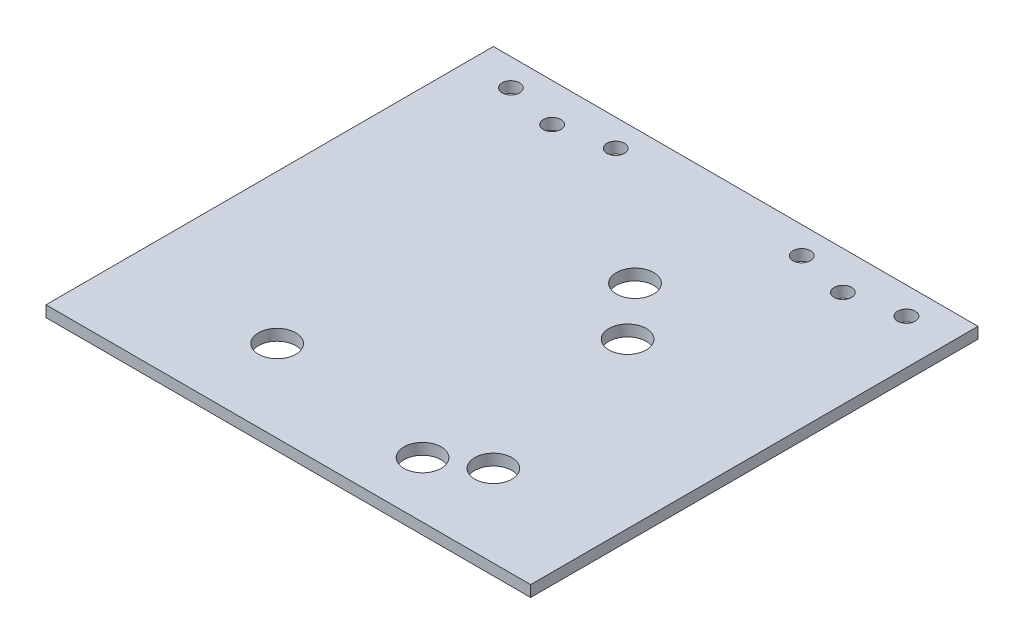
ISO-10303-21;
HEADER;
FILE_DESCRIPTION(('STEP AP214'),'2;1');
FILE_NAME('part.step','',(''),(''),'','','');
FILE_SCHEMA(('AUTOMOTIVE_DESIGN { 1 0 10303 214 1 1 1 1 }'));
ENDSEC;
DATA;
#1=APPLICATION_CONTEXT('core data for automotive mechanical design processes');
#2=APPLICATION_PROTOCOL_DEFINITION('international standard','automotive_design',2000,#1);
#3=PRODUCT_CONTEXT('',#1,'mechanical');
#4=PRODUCT('Part','Part','',(#3));
#5=PRODUCT_RELATED_PRODUCT_CATEGORY('part','',(#4));
#6=PRODUCT_DEFINITION_FORMATION('','',#4);
#7=PRODUCT_DEFINITION_CONTEXT('part definition',#1,'design');
#8=PRODUCT_DEFINITION('design','',#6,#7);
#9=PRODUCT_DEFINITION_SHAPE('','',#8);
#10=(LENGTH_UNIT() NAMED_UNIT(*) SI_UNIT(.MILLI.,.METRE.));
#11=(NAMED_UNIT(*) PLANE_ANGLE_UNIT() SI_UNIT($,.RADIAN.));
#12=(NAMED_UNIT(*) SI_UNIT($,.STERADIAN.) SOLID_ANGLE_UNIT());
#13=UNCERTAINTY_MEASURE_WITH_UNIT(LENGTH_MEASURE(1.E-05),#10,'distance_accuracy_value','');
#14=(GEOMETRIC_REPRESENTATION_CONTEXT(3) GLOBAL_UNCERTAINTY_ASSIGNED_CONTEXT((#13)) GLOBAL_UNIT_ASSIGNED_CONTEXT((#10,
#11,#12)) REPRESENTATION_CONTEXT('',''));
#15=CARTESIAN_POINT('',(0.,0.,0.));
#16=DIRECTION('',(0.,0.,1.));
#17=DIRECTION('',(1.,0.,0.));
#18=AXIS2_PLACEMENT_3D('',#15,#16,#17);
#19=CARTESIAN_POINT('',(0.,3.,0.));
#20=DIRECTION('',(1.,0.,0.));
#21=DIRECTION('',(0.,0.,-1.));
#22=AXIS2_PLACEMENT_3D('',#19,#20,#21);
#23=PLANE('',#22);
#24=DIRECTION('',(0.,-1.,0.));
#25=VECTOR('',#24,1.);
#26=CARTESIAN_POINT('',(0.,3.,30.));
#27=LINE('',#26,#25);
#28=CARTESIAN_POINT('',(0.,3.,30.));
#29=VERTEX_POINT('',#28);
#30=CARTESIAN_POINT('',(0.,0.,30.));
#31=VERTEX_POINT('',#30);
#32=EDGE_CURVE('E122',#29,#31,#27,.T.);
#33=ORIENTED_EDGE('',*,*,#32,.T.);
#34=DIRECTION('',(0.,0.,1.));
#35=VECTOR('',#34,1.);
#36=CARTESIAN_POINT('',(0.,0.,0.));
#37=LINE('',#36,#35);
#38=CARTESIAN_POINT('',(0.,0.,150.));
#39=VERTEX_POINT('',#38);
#40=EDGE_CURVE('E77',#31,#39,#37,.T.);
#41=ORIENTED_EDGE('',*,*,#40,.T.);
#42=DIRECTION('',(0.,-1.,0.));
#43=VECTOR('',#42,1.);
#44=CARTESIAN_POINT('',(0.,3.,150.));
#45=LINE('',#44,#43);
#46=CARTESIAN_POINT('',(0.,3.,150.));
#47=VERTEX_POINT('',#46);
#48=EDGE_CURVE('E11',#47,#39,#45,.T.);
#49=ORIENTED_EDGE('',*,*,#48,.F.);
#50=DIRECTION('',(0.,0.,1.));
#51=VECTOR('',#50,1.);
#52=CARTESIAN_POINT('',(0.,3.,0.));
#53=LINE('',#52,#51);
#54=EDGE_CURVE('E85',#29,#47,#53,.T.);
#55=ORIENTED_EDGE('',*,*,#54,.F.);
#56=EDGE_LOOP('',(#33,#41,#49,#55));
#57=FACE_BOUND('',#56,.T.);
#58=ADVANCED_FACE('F33',(#57),#23,.F.);
#59=CARTESIAN_POINT('',(130.,3.,0.));
#60=DIRECTION('',(-1.,0.,0.));
#61=DIRECTION('',(0.,0.,1.));
#62=AXIS2_PLACEMENT_3D('',#59,#60,#61);
#63=PLANE('',#62);
#64=DIRECTION('',(0.,-1.,0.));
#65=VECTOR('',#64,1.);
#66=CARTESIAN_POINT('',(130.,3.,30.));
#67=LINE('',#66,#65);
#68=CARTESIAN_POINT('',(130.,3.,30.));
#69=VERTEX_POINT('',#68);
#70=CARTESIAN_POINT('',(130.,0.,30.));
#71=VERTEX_POINT('',#70);
#72=EDGE_CURVE('E47',#69,#71,#67,.T.);
#73=ORIENTED_EDGE('',*,*,#72,.F.);
#74=DIRECTION('',(0.,0.,-1.));
#75=VECTOR('',#74,1.);
#76=CARTESIAN_POINT('',(130.,3.,0.));
#77=LINE('',#76,#75);
#78=CARTESIAN_POINT('',(130.,3.,150.));
#79=VERTEX_POINT('',#78);
#80=EDGE_CURVE('E82',#79,#69,#77,.T.);
#81=ORIENTED_EDGE('',*,*,#80,.F.);
#82=DIRECTION('',(0.,-1.,0.));
#83=VECTOR('',#82,1.);
#84=CARTESIAN_POINT('',(130.,3.,150.));
#85=LINE('',#84,#83);
#86=CARTESIAN_POINT('',(130.,0.,150.));
#87=VERTEX_POINT('',#86);
#88=EDGE_CURVE('E40',#79,#87,#85,.T.);
#89=ORIENTED_EDGE('',*,*,#88,.T.);
#90=DIRECTION('',(0.,0.,-1.));
#91=VECTOR('',#90,1.);
#92=CARTESIAN_POINT('',(130.,0.,0.));
#93=LINE('',#92,#91);
#94=EDGE_CURVE('E76',#87,#71,#93,.T.);
#95=ORIENTED_EDGE('',*,*,#94,.T.);
#96=EDGE_LOOP('',(#73,#81,#89,#95));
#97=FACE_BOUND('',#96,.T.);
#98=ADVANCED_FACE('F81',(#97),#63,.F.);
#99=CARTESIAN_POINT('',(0.,3.,0.));
#100=DIRECTION('',(0.,1.,0.));
#101=DIRECTION('',(0.,0.,1.));
#102=AXIS2_PLACEMENT_3D('',#99,#100,#101);
#103=PLANE('',#102);
#104=CARTESIAN_POINT('',(26.,3.,40.25));
#105=DIRECTION('',(0.,1.,0.));
#106=DIRECTION('',(0.,0.,1.));
#107=AXIS2_PLACEMENT_3D('',#104,#105,#106);
#108=CIRCLE('',#107,2.35);
#109=CARTESIAN_POINT('',(26.,3.,37.9));
#110=VERTEX_POINT('',#109);
#111=EDGE_CURVE('E157',#110,#110,#108,.T.);
#112=ORIENTED_EDGE('',*,*,#111,.F.);
#113=EDGE_LOOP('',(#112));
#114=FACE_BOUND('',#113,.T.);
#115=CARTESIAN_POINT('',(40.05,3.,37.25));
#116=DIRECTION('',(0.,1.,0.));
#117=DIRECTION('',(0.,0.,1.));
#118=AXIS2_PLACEMENT_3D('',#115,#116,#117);
#119=CIRCLE('',#118,2.35);
#120=CARTESIAN_POINT('',(40.05,3.,34.9));
#121=VERTEX_POINT('',#120);
#122=EDGE_CURVE('E151',#121,#121,#119,.T.);
#123=ORIENTED_EDGE('',*,*,#122,.F.);
#124=EDGE_LOOP('',(#123));
#125=FACE_BOUND('',#124,.T.);
#126=CARTESIAN_POINT('',(11.95,3.,37.25));
#127=DIRECTION('',(0.,1.,0.));
#128=DIRECTION('',(0.,0.,1.));
#129=AXIS2_PLACEMENT_3D('',#126,#127,#128);
#130=CIRCLE('',#129,2.35);
#131=CARTESIAN_POINT('',(11.95,3.,34.9));
#132=VERTEX_POINT('',#131);
#133=EDGE_CURVE('E145',#132,#132,#130,.T.);
#134=ORIENTED_EDGE('',*,*,#133,.F.);
#135=EDGE_LOOP('',(#134));
#136=FACE_BOUND('',#135,.T.);
#137=CARTESIAN_POINT('',(104.,3.,40.25));
#138=DIRECTION('',(0.,1.,0.));
#139=DIRECTION('',(0.,0.,1.));
#140=AXIS2_PLACEMENT_3D('',#137,#138,#139);
#141=CIRCLE('',#140,2.35);
#142=CARTESIAN_POINT('',(104.,3.,37.9));
#143=VERTEX_POINT('',#142);
#144=EDGE_CURVE('E139',#143,#143,#141,.T.);
#145=ORIENTED_EDGE('',*,*,#144,.F.);
#146=EDGE_LOOP('',(#145));
#147=FACE_BOUND('',#146,.T.);
#148=CARTESIAN_POINT('',(118.05,3.,37.25));
#149=DIRECTION('',(0.,1.,0.));
#150=DIRECTION('',(0.,0.,1.));
#151=AXIS2_PLACEMENT_3D('',#148,#149,#150);
#152=CIRCLE('',#151,2.35);
#153=CARTESIAN_POINT('',(118.05,3.,34.9));
#154=VERTEX_POINT('',#153);
#155=EDGE_CURVE('E133',#154,#154,#152,.T.);
#156=ORIENTED_EDGE('',*,*,#155,.F.);
#157=EDGE_LOOP('',(#156));
#158=FACE_BOUND('',#157,.T.);
#159=CARTESIAN_POINT('',(89.95,3.,37.25));
#160=DIRECTION('',(0.,1.,0.));
#161=DIRECTION('',(0.,0.,1.));
#162=AXIS2_PLACEMENT_3D('',#159,#160,#161);
#163=CIRCLE('',#162,2.35);
#164=CARTESIAN_POINT('',(89.95,3.,34.9));
#165=VERTEX_POINT('',#164);
#166=EDGE_CURVE('E128',#165,#165,#163,.T.);
#167=ORIENTED_EDGE('',*,*,#166,.F.);
#168=EDGE_LOOP('',(#167));
#169=FACE_BOUND('',#168,.T.);
#170=CARTESIAN_POINT('',(74.,3.,66.));
#171=DIRECTION('',(0.,1.,0.));
#172=DIRECTION('',(0.,0.,1.));
#173=AXIS2_PLACEMENT_3D('',#170,#171,#172);
#174=CIRCLE('',#173,5.);
#175=CARTESIAN_POINT('',(74.,3.,71.));
#176=VERTEX_POINT('',#175);
#177=EDGE_CURVE('E95',#176,#176,#174,.T.);
#178=ORIENTED_EDGE('',*,*,#177,.F.);
#179=EDGE_LOOP('',(#178));
#180=FACE_BOUND('',#179,.T.);
#181=CARTESIAN_POINT('',(98.,3.,128.));
#182=DIRECTION('',(0.,1.,0.));
#183=DIRECTION('',(0.,0.,1.));
#184=AXIS2_PLACEMENT_3D('',#181,#182,#183);
#185=CIRCLE('',#184,5.);
#186=CARTESIAN_POINT('',(98.,3.,133.));
#187=VERTEX_POINT('',#186);
#188=EDGE_CURVE('E101',#187,#187,#185,.T.);
#189=ORIENTED_EDGE('',*,*,#188,.F.);
#190=EDGE_LOOP('',(#189));
#191=FACE_BOUND('',#190,.T.);
#192=CARTESIAN_POINT('',(40.,3.,128.));
#193=DIRECTION('',(0.,1.,0.));
#194=DIRECTION('',(0.,0.,1.));
#195=AXIS2_PLACEMENT_3D('',#192,#193,#194);
#196=CIRCLE('',#195,5.);
#197=CARTESIAN_POINT('',(40.,3.,133.));
#198=VERTEX_POINT('',#197);
#199=EDGE_CURVE('E107',#198,#198,#196,.T.);
#200=ORIENTED_EDGE('',*,*,#199,.F.);
#201=EDGE_LOOP('',(#200));
#202=FACE_BOUND('',#201,.T.);
#203=CARTESIAN_POINT('',(86.,3.,80.));
#204=DIRECTION('',(0.,1.,0.));
#205=DIRECTION('',(0.,0.,1.));
#206=AXIS2_PLACEMENT_3D('',#203,#204,#205);
#207=CIRCLE('',#206,5.);
#208=CARTESIAN_POINT('',(86.,3.,85.));
#209=VERTEX_POINT('',#208);
#210=EDGE_CURVE('E113',#209,#209,#207,.T.);
#211=ORIENTED_EDGE('',*,*,#210,.F.);
#212=EDGE_LOOP('',(#211));
#213=FACE_BOUND('',#212,.T.);
#214=CARTESIAN_POINT('',(86.,3.,135.));
#215=DIRECTION('',(0.,1.,0.));
#216=DIRECTION('',(0.,0.,1.));
#217=AXIS2_PLACEMENT_3D('',#214,#215,#216);
#218=CIRCLE('',#217,5.);
#219=CARTESIAN_POINT('',(86.,3.,140.));
#220=VERTEX_POINT('',#219);
#221=EDGE_CURVE('E119',#220,#220,#218,.T.);
#222=ORIENTED_EDGE('',*,*,#221,.F.);
#223=EDGE_LOOP('',(#222));
#224=FACE_BOUND('',#223,.T.);
#225=ORIENTED_EDGE('',*,*,#80,.T.);
#226=DIRECTION('',(1.,0.,0.));
#227=VECTOR('',#226,1.);
#228=CARTESIAN_POINT('',(0.,3.,30.));
#229=LINE('',#228,#227);
#230=EDGE_CURVE('E126',#29,#69,#229,.T.);
#231=ORIENTED_EDGE('',*,*,#230,.F.);
#232=ORIENTED_EDGE('',*,*,#54,.T.);
#233=DIRECTION('',(1.,0.,0.));
#234=VECTOR('',#233,1.);
#235=CARTESIAN_POINT('',(0.,3.,150.));
#236=LINE('',#235,#234);
#237=EDGE_CURVE('E56',#47,#79,#236,.T.);
#238=ORIENTED_EDGE('',*,*,#237,.T.);
#239=EDGE_LOOP('',(#225,#231,#232,#238));
#240=FACE_BOUND('',#239,.T.);
#241=ADVANCED_FACE('F169',(#114,#125,#136,#147,#158,#169,#180,#191,#202,#213,#224,#240),#103,.T.);
#242=CARTESIAN_POINT('',(0.,0.,0.));
#243=DIRECTION('',(0.,1.,0.));
#244=DIRECTION('',(0.,0.,1.));
#245=AXIS2_PLACEMENT_3D('',#242,#243,#244);
#246=PLANE('',#245);
#247=CARTESIAN_POINT('',(26.,0.,40.25));
#248=DIRECTION('',(0.,1.,0.));
#249=DIRECTION('',(0.,0.,1.));
#250=AXIS2_PLACEMENT_3D('',#247,#248,#249);
#251=CIRCLE('',#250,2.35);
#252=CARTESIAN_POINT('',(26.,0.,37.9));
#253=VERTEX_POINT('',#252);
#254=EDGE_CURVE('E160',#253,#253,#251,.T.);
#255=ORIENTED_EDGE('',*,*,#254,.T.);
#256=EDGE_LOOP('',(#255));
#257=FACE_BOUND('',#256,.T.);
#258=CARTESIAN_POINT('',(40.05,0.,37.25));
#259=DIRECTION('',(0.,1.,0.));
#260=DIRECTION('',(0.,0.,1.));
#261=AXIS2_PLACEMENT_3D('',#258,#259,#260);
#262=CIRCLE('',#261,2.35);
#263=CARTESIAN_POINT('',(40.05,0.,34.9));
#264=VERTEX_POINT('',#263);
#265=EDGE_CURVE('E154',#264,#264,#262,.T.);
#266=ORIENTED_EDGE('',*,*,#265,.T.);
#267=EDGE_LOOP('',(#266));
#268=FACE_BOUND('',#267,.T.);
#269=CARTESIAN_POINT('',(11.95,0.,37.25));
#270=DIRECTION('',(0.,1.,0.));
#271=DIRECTION('',(0.,0.,1.));
#272=AXIS2_PLACEMENT_3D('',#269,#270,#271);
#273=CIRCLE('',#272,2.35);
#274=CARTESIAN_POINT('',(11.95,0.,34.9));
#275=VERTEX_POINT('',#274);
#276=EDGE_CURVE('E148',#275,#275,#273,.T.);
#277=ORIENTED_EDGE('',*,*,#276,.T.);
#278=EDGE_LOOP('',(#277));
#279=FACE_BOUND('',#278,.T.);
#280=CARTESIAN_POINT('',(104.,0.,40.25));
#281=DIRECTION('',(0.,1.,0.));
#282=DIRECTION('',(0.,0.,1.));
#283=AXIS2_PLACEMENT_3D('',#280,#281,#282);
#284=CIRCLE('',#283,2.35);
#285=CARTESIAN_POINT('',(104.,0.,37.9));
#286=VERTEX_POINT('',#285);
#287=EDGE_CURVE('E142',#286,#286,#284,.T.);
#288=ORIENTED_EDGE('',*,*,#287,.T.);
#289=EDGE_LOOP('',(#288));
#290=FACE_BOUND('',#289,.T.);
#291=CARTESIAN_POINT('',(118.05,0.,37.25));
#292=DIRECTION('',(0.,1.,0.));
#293=DIRECTION('',(0.,0.,1.));
#294=AXIS2_PLACEMENT_3D('',#291,#292,#293);
#295=CIRCLE('',#294,2.35);
#296=CARTESIAN_POINT('',(118.05,0.,34.9));
#297=VERTEX_POINT('',#296);
#298=EDGE_CURVE('E136',#297,#297,#295,.T.);
#299=ORIENTED_EDGE('',*,*,#298,.T.);
#300=EDGE_LOOP('',(#299));
#301=FACE_BOUND('',#300,.T.);
#302=CARTESIAN_POINT('',(89.95,0.,37.25));
#303=DIRECTION('',(0.,1.,0.));
#304=DIRECTION('',(0.,0.,1.));
#305=AXIS2_PLACEMENT_3D('',#302,#303,#304);
#306=CIRCLE('',#305,2.35);
#307=CARTESIAN_POINT('',(89.95,0.,34.9));
#308=VERTEX_POINT('',#307);
#309=EDGE_CURVE('E130',#308,#308,#306,.T.);
#310=ORIENTED_EDGE('',*,*,#309,.T.);
#311=EDGE_LOOP('',(#310));
#312=FACE_BOUND('',#311,.T.);
#313=CARTESIAN_POINT('',(74.,0.,66.));
#314=DIRECTION('',(0.,1.,0.));
#315=DIRECTION('',(0.,0.,1.));
#316=AXIS2_PLACEMENT_3D('',#313,#314,#315);
#317=CIRCLE('',#316,5.);
#318=CARTESIAN_POINT('',(74.,0.,71.));
#319=VERTEX_POINT('',#318);
#320=EDGE_CURVE('E90',#319,#319,#317,.T.);
#321=ORIENTED_EDGE('',*,*,#320,.T.);
#322=EDGE_LOOP('',(#321));
#323=FACE_BOUND('',#322,.T.);
#324=CARTESIAN_POINT('',(98.,0.,128.));
#325=DIRECTION('',(0.,1.,0.));
#326=DIRECTION('',(0.,0.,1.));
#327=AXIS2_PLACEMENT_3D('',#324,#325,#326);
#328=CIRCLE('',#327,5.);
#329=CARTESIAN_POINT('',(98.,0.,133.));
#330=VERTEX_POINT('',#329);
#331=EDGE_CURVE('E98',#330,#330,#328,.T.);
#332=ORIENTED_EDGE('',*,*,#331,.T.);
#333=EDGE_LOOP('',(#332));
#334=FACE_BOUND('',#333,.T.);
#335=CARTESIAN_POINT('',(40.,0.,128.));
#336=DIRECTION('',(0.,1.,0.));
#337=DIRECTION('',(0.,0.,1.));
#338=AXIS2_PLACEMENT_3D('',#335,#336,#337);
#339=CIRCLE('',#338,5.);
#340=CARTESIAN_POINT('',(40.,0.,133.));
#341=VERTEX_POINT('',#340);
#342=EDGE_CURVE('E104',#341,#341,#339,.T.);
#343=ORIENTED_EDGE('',*,*,#342,.T.);
#344=EDGE_LOOP('',(#343));
#345=FACE_BOUND('',#344,.T.);
#346=CARTESIAN_POINT('',(86.,0.,80.));
#347=DIRECTION('',(0.,1.,0.));
#348=DIRECTION('',(0.,0.,1.));
#349=AXIS2_PLACEMENT_3D('',#346,#347,#348);
#350=CIRCLE('',#349,5.);
#351=CARTESIAN_POINT('',(86.,0.,85.));
#352=VERTEX_POINT('',#351);
#353=EDGE_CURVE('E110',#352,#352,#350,.T.);
#354=ORIENTED_EDGE('',*,*,#353,.T.);
#355=EDGE_LOOP('',(#354));
#356=FACE_BOUND('',#355,.T.);
#357=CARTESIAN_POINT('',(86.,0.,135.));
#358=DIRECTION('',(0.,1.,0.));
#359=DIRECTION('',(0.,0.,1.));
#360=AXIS2_PLACEMENT_3D('',#357,#358,#359);
#361=CIRCLE('',#360,5.);
#362=CARTESIAN_POINT('',(86.,0.,140.));
#363=VERTEX_POINT('',#362);
#364=EDGE_CURVE('E116',#363,#363,#361,.T.);
#365=ORIENTED_EDGE('',*,*,#364,.T.);
#366=EDGE_LOOP('',(#365));
#367=FACE_BOUND('',#366,.T.);
#368=DIRECTION('',(1.,0.,0.));
#369=VECTOR('',#368,1.);
#370=CARTESIAN_POINT('',(0.,0.,30.));
#371=LINE('',#370,#369);
#372=EDGE_CURVE('E84',#31,#71,#371,.T.);
#373=ORIENTED_EDGE('',*,*,#372,.T.);
#374=ORIENTED_EDGE('',*,*,#94,.F.);
#375=DIRECTION('',(1.,0.,0.));
#376=VECTOR('',#375,1.);
#377=CARTESIAN_POINT('',(0.,0.,150.));
#378=LINE('',#377,#376);
#379=EDGE_CURVE('E68',#39,#87,#378,.T.);
#380=ORIENTED_EDGE('',*,*,#379,.F.);
#381=ORIENTED_EDGE('',*,*,#40,.F.);
#382=EDGE_LOOP('',(#373,#374,#380,#381));
#383=FACE_BOUND('',#382,.T.);
#384=ADVANCED_FACE('F83',(#257,#268,#279,#290,#301,#312,#323,#334,#345,#356,#367,#383),#246,.F.);
#385=CARTESIAN_POINT('',(0.,3.,150.));
#386=DIRECTION('',(0.,0.,-1.));
#387=DIRECTION('',(-1.,0.,0.));
#388=AXIS2_PLACEMENT_3D('',#385,#386,#387);
#389=PLANE('',#388);
#390=ORIENTED_EDGE('',*,*,#379,.T.);
#391=ORIENTED_EDGE('',*,*,#88,.F.);
#392=ORIENTED_EDGE('',*,*,#237,.F.);
#393=ORIENTED_EDGE('',*,*,#48,.T.);
#394=EDGE_LOOP('',(#390,#391,#392,#393));
#395=FACE_BOUND('',#394,.T.);
#396=ADVANCED_FACE('F70',(#395),#389,.F.);
#397=CARTESIAN_POINT('',(74.,3.,66.));
#398=DIRECTION('',(0.,1.,0.));
#399=DIRECTION('',(0.,0.,1.));
#400=AXIS2_PLACEMENT_3D('',#397,#398,#399);
#401=CYLINDRICAL_SURFACE('',#400,5.);
#402=ORIENTED_EDGE('',*,*,#320,.F.);
#403=EDGE_LOOP('',(#402));
#404=FACE_BOUND('',#403,.T.);
#405=ORIENTED_EDGE('',*,*,#177,.T.);
#406=EDGE_LOOP('',(#405));
#407=FACE_BOUND('',#406,.T.);
#408=ADVANCED_FACE('F210',(#404,#407),#401,.F.);
#409=CARTESIAN_POINT('',(98.,3.,128.));
#410=DIRECTION('',(0.,1.,0.));
#411=DIRECTION('',(0.,0.,1.));
#412=AXIS2_PLACEMENT_3D('',#409,#410,#411);
#413=CYLINDRICAL_SURFACE('',#412,5.);
#414=ORIENTED_EDGE('',*,*,#331,.F.);
#415=EDGE_LOOP('',(#414));
#416=FACE_BOUND('',#415,.T.);
#417=ORIENTED_EDGE('',*,*,#188,.T.);
#418=EDGE_LOOP('',(#417));
#419=FACE_BOUND('',#418,.T.);
#420=ADVANCED_FACE('F215',(#416,#419),#413,.F.);
#421=CARTESIAN_POINT('',(40.,3.,128.));
#422=DIRECTION('',(0.,1.,0.));
#423=DIRECTION('',(0.,0.,1.));
#424=AXIS2_PLACEMENT_3D('',#421,#422,#423);
#425=CYLINDRICAL_SURFACE('',#424,5.);
#426=ORIENTED_EDGE('',*,*,#342,.F.);
#427=EDGE_LOOP('',(#426));
#428=FACE_BOUND('',#427,.T.);
#429=ORIENTED_EDGE('',*,*,#199,.T.);
#430=EDGE_LOOP('',(#429));
#431=FACE_BOUND('',#430,.T.);
#432=ADVANCED_FACE('F254',(#428,#431),#425,.F.);
#433=CARTESIAN_POINT('',(86.,3.,80.));
#434=DIRECTION('',(0.,1.,0.));
#435=DIRECTION('',(0.,0.,1.));
#436=AXIS2_PLACEMENT_3D('',#433,#434,#435);
#437=CYLINDRICAL_SURFACE('',#436,5.);
#438=ORIENTED_EDGE('',*,*,#353,.F.);
#439=EDGE_LOOP('',(#438));
#440=FACE_BOUND('',#439,.T.);
#441=ORIENTED_EDGE('',*,*,#210,.T.);
#442=EDGE_LOOP('',(#441));
#443=FACE_BOUND('',#442,.T.);
#444=ADVANCED_FACE('F246',(#440,#443),#437,.F.);
#445=CARTESIAN_POINT('',(86.,3.,135.));
#446=DIRECTION('',(0.,1.,0.));
#447=DIRECTION('',(0.,0.,1.));
#448=AXIS2_PLACEMENT_3D('',#445,#446,#447);
#449=CYLINDRICAL_SURFACE('',#448,5.);
#450=ORIENTED_EDGE('',*,*,#364,.F.);
#451=EDGE_LOOP('',(#450));
#452=FACE_BOUND('',#451,.T.);
#453=ORIENTED_EDGE('',*,*,#221,.T.);
#454=EDGE_LOOP('',(#453));
#455=FACE_BOUND('',#454,.T.);
#456=ADVANCED_FACE('F243',(#452,#455),#449,.F.);
#457=CARTESIAN_POINT('',(0.,3.,30.));
#458=DIRECTION('',(0.,0.,-1.));
#459=DIRECTION('',(-1.,0.,0.));
#460=AXIS2_PLACEMENT_3D('',#457,#458,#459);
#461=PLANE('',#460);
#462=ORIENTED_EDGE('',*,*,#372,.F.);
#463=ORIENTED_EDGE('',*,*,#32,.F.);
#464=ORIENTED_EDGE('',*,*,#230,.T.);
#465=ORIENTED_EDGE('',*,*,#72,.T.);
#466=EDGE_LOOP('',(#462,#463,#464,#465));
#467=FACE_BOUND('',#466,.T.);
#468=ADVANCED_FACE('F199',(#467),#461,.T.);
#469=CARTESIAN_POINT('',(89.95,3.,37.25));
#470=DIRECTION('',(0.,-1.,0.));
#471=DIRECTION('',(0.,0.,-1.));
#472=AXIS2_PLACEMENT_3D('',#469,#470,#471);
#473=CYLINDRICAL_SURFACE('',#472,2.35);
#474=CARTESIAN_POINT('',(89.95,3.,34.9));
#475=CARTESIAN_POINT('',(89.95,2.96875,34.9));
#476=CARTESIAN_POINT('',(89.95,2.9375,34.9));
#477=CARTESIAN_POINT('',(89.95,2.875,34.9));
#478=CARTESIAN_POINT('',(89.95,2.84375,34.9));
#479=CARTESIAN_POINT('',(89.95,2.78125,34.9));
#480=CARTESIAN_POINT('',(89.95,2.75,34.9));
#481=CARTESIAN_POINT('',(89.95,2.6875,34.9));
#482=CARTESIAN_POINT('',(89.95,2.65625,34.9));
#483=CARTESIAN_POINT('',(89.95,2.59375,34.9));
#484=CARTESIAN_POINT('',(89.95,2.5625,34.9));
#485=CARTESIAN_POINT('',(89.95,2.5,34.9));
#486=CARTESIAN_POINT('',(89.95,2.46875,34.9));
#487=CARTESIAN_POINT('',(89.95,2.40625,34.9));
#488=CARTESIAN_POINT('',(89.95,2.375,34.9));
#489=CARTESIAN_POINT('',(89.95,2.3125,34.9));
#490=CARTESIAN_POINT('',(89.95,2.28125,34.9));
#491=CARTESIAN_POINT('',(89.95,2.21875,34.9));
#492=CARTESIAN_POINT('',(89.95,2.1875,34.9));
#493=CARTESIAN_POINT('',(89.95,2.125,34.9));
#494=CARTESIAN_POINT('',(89.95,2.09375,34.9));
#495=CARTESIAN_POINT('',(89.95,2.03125,34.9));
#496=CARTESIAN_POINT('',(89.95,2.,34.9));
#497=CARTESIAN_POINT('',(89.95,1.9375,34.9));
#498=CARTESIAN_POINT('',(89.95,1.90625,34.9));
#499=CARTESIAN_POINT('',(89.95,1.84375,34.9));
#500=CARTESIAN_POINT('',(89.95,1.8125,34.9));
#501=CARTESIAN_POINT('',(89.95,1.75,34.9));
#502=CARTESIAN_POINT('',(89.95,1.71875,34.9));
#503=CARTESIAN_POINT('',(89.95,1.65625,34.9));
#504=CARTESIAN_POINT('',(89.95,1.625,34.9));
#505=CARTESIAN_POINT('',(89.95,1.5625,34.9));
#506=CARTESIAN_POINT('',(89.95,1.53125,34.9));
#507=CARTESIAN_POINT('',(89.95,1.46875,34.9));
#508=CARTESIAN_POINT('',(89.95,1.4375,34.9));
#509=CARTESIAN_POINT('',(89.95,1.375,34.9));
#510=CARTESIAN_POINT('',(89.95,1.34375,34.9));
#511=CARTESIAN_POINT('',(89.95,1.28125,34.9));
#512=CARTESIAN_POINT('',(89.95,1.25,34.9));
#513=CARTESIAN_POINT('',(89.95,1.1875,34.9));
#514=CARTESIAN_POINT('',(89.95,1.15625,34.9));
#515=CARTESIAN_POINT('',(89.95,1.09375,34.9));
#516=CARTESIAN_POINT('',(89.95,1.0625,34.9));
#517=CARTESIAN_POINT('',(89.95,1.,34.9));
#518=CARTESIAN_POINT('',(89.95,0.96875,34.9));
#519=CARTESIAN_POINT('',(89.95,0.90625,34.9));
#520=CARTESIAN_POINT('',(89.95,0.875,34.9));
#521=CARTESIAN_POINT('',(89.95,0.8125,34.9));
#522=CARTESIAN_POINT('',(89.95,0.78125,34.9));
#523=CARTESIAN_POINT('',(89.95,0.71875,34.9));
#524=CARTESIAN_POINT('',(89.95,0.6875,34.9));
#525=CARTESIAN_POINT('',(89.95,0.625,34.9));
#526=CARTESIAN_POINT('',(89.95,0.59375,34.9));
#527=CARTESIAN_POINT('',(89.95,0.53125,34.9));
#528=CARTESIAN_POINT('',(89.95,0.5,34.9));
#529=CARTESIAN_POINT('',(89.95,0.4375,34.9));
#530=CARTESIAN_POINT('',(89.95,0.40625,34.9));
#531=CARTESIAN_POINT('',(89.95,0.34375,34.9));
#532=CARTESIAN_POINT('',(89.95,0.3125,34.9));
#533=CARTESIAN_POINT('',(89.95,0.25,34.9));
#534=CARTESIAN_POINT('',(89.95,0.21875,34.9));
#535=CARTESIAN_POINT('',(89.95,0.15625,34.9));
#536=CARTESIAN_POINT('',(89.95,0.125,34.9));
#537=CARTESIAN_POINT('',(89.95,0.0625000000000001,34.9));
#538=CARTESIAN_POINT('',(89.95,0.03125,34.9));
#539=CARTESIAN_POINT('',(89.95,0.,34.9));
#540=B_SPLINE_CURVE_WITH_KNOTS('',3,(#474,#475,#476,#477,#478,#479,#480,#481,#482,#483,#484,
#485,#486,#487,#488,#489,#490,#491,#492,#493,#494,#495,#496,#497,#498,#499,#500,#501,#502,#503,
#504,#505,#506,#507,#508,#509,#510,#511,#512,#513,#514,#515,#516,#517,#518,#519,#520,#521,#522,
#523,#524,#525,#526,#527,#528,#529,#530,#531,#532,#533,#534,#535,#536,#537,#538,#539),
.UNSPECIFIED.,.F.,.F.,(4,2,2,2,2,2,2,2,2,2,2,2,2,2,2,2,2,2,2,2,2,2,2,2,2,2,2,2,2,2,2,2,4),(0.,
0.0937499999999997,0.1875,0.28125,0.375,0.46875,0.5625,0.65625,0.75,0.84375,0.9375,1.03125,
1.125,1.21875,1.3125,1.40625,1.5,1.59375,1.6875,1.78125,1.875,1.96875,2.0625,2.15625,2.25,
2.34375,2.4375,2.53125,2.625,2.71875,2.8125,2.90625,3.),.UNSPECIFIED.);
#541=EDGE_CURVE('BSEAM252',#165,#308,#540,.T.);
#542=ORIENTED_EDGE('',*,*,#166,.T.);
#543=ORIENTED_EDGE('',*,*,#309,.F.);
#544=ORIENTED_EDGE('',*,*,#541,.T.);
#545=ORIENTED_EDGE('',*,*,#541,.F.);
#546=EDGE_LOOP('',(#542,#544,#543,#545));
#547=FACE_BOUND('',#546,.T.);
#548=ADVANCED_FACE('F252',(#547),#473,.F.);
#549=CARTESIAN_POINT('',(118.05,3.,37.25));
#550=DIRECTION('',(0.,-1.,0.));
#551=DIRECTION('',(0.,0.,-1.));
#552=AXIS2_PLACEMENT_3D('',#549,#550,#551);
#553=CYLINDRICAL_SURFACE('',#552,2.35);
#554=CARTESIAN_POINT('',(118.05,3.,34.9));
#555=CARTESIAN_POINT('',(118.05,2.96875,34.9));
#556=CARTESIAN_POINT('',(118.05,2.9375,34.9));
#557=CARTESIAN_POINT('',(118.05,2.875,34.9));
#558=CARTESIAN_POINT('',(118.05,2.84375,34.9));
#559=CARTESIAN_POINT('',(118.05,2.78125,34.9));
#560=CARTESIAN_POINT('',(118.05,2.75,34.9));
#561=CARTESIAN_POINT('',(118.05,2.6875,34.9));
#562=CARTESIAN_POINT('',(118.05,2.65625,34.9));
#563=CARTESIAN_POINT('',(118.05,2.59375,34.9));
#564=CARTESIAN_POINT('',(118.05,2.5625,34.9));
#565=CARTESIAN_POINT('',(118.05,2.5,34.9));
#566=CARTESIAN_POINT('',(118.05,2.46875,34.9));
#567=CARTESIAN_POINT('',(118.05,2.40625,34.9));
#568=CARTESIAN_POINT('',(118.05,2.375,34.9));
#569=CARTESIAN_POINT('',(118.05,2.3125,34.9));
#570=CARTESIAN_POINT('',(118.05,2.28125,34.9));
#571=CARTESIAN_POINT('',(118.05,2.21875,34.9));
#572=CARTESIAN_POINT('',(118.05,2.1875,34.9));
#573=CARTESIAN_POINT('',(118.05,2.125,34.9));
#574=CARTESIAN_POINT('',(118.05,2.09375,34.9));
#575=CARTESIAN_POINT('',(118.05,2.03125,34.9));
#576=CARTESIAN_POINT('',(118.05,2.,34.9));
#577=CARTESIAN_POINT('',(118.05,1.9375,34.9));
#578=CARTESIAN_POINT('',(118.05,1.90625,34.9));
#579=CARTESIAN_POINT('',(118.05,1.84375,34.9));
#580=CARTESIAN_POINT('',(118.05,1.8125,34.9));
#581=CARTESIAN_POINT('',(118.05,1.75,34.9));
#582=CARTESIAN_POINT('',(118.05,1.71875,34.9));
#583=CARTESIAN_POINT('',(118.05,1.65625,34.9));
#584=CARTESIAN_POINT('',(118.05,1.625,34.9));
#585=CARTESIAN_POINT('',(118.05,1.5625,34.9));
#586=CARTESIAN_POINT('',(118.05,1.53125,34.9));
#587=CARTESIAN_POINT('',(118.05,1.46875,34.9));
#588=CARTESIAN_POINT('',(118.05,1.4375,34.9));
#589=CARTESIAN_POINT('',(118.05,1.375,34.9));
#590=CARTESIAN_POINT('',(118.05,1.34375,34.9));
#591=CARTESIAN_POINT('',(118.05,1.28125,34.9));
#592=CARTESIAN_POINT('',(118.05,1.25,34.9));
#593=CARTESIAN_POINT('',(118.05,1.1875,34.9));
#594=CARTESIAN_POINT('',(118.05,1.15625,34.9));
#595=CARTESIAN_POINT('',(118.05,1.09375,34.9));
#596=CARTESIAN_POINT('',(118.05,1.0625,34.9));
#597=CARTESIAN_POINT('',(118.05,1.,34.9));
#598=CARTESIAN_POINT('',(118.05,0.96875,34.9));
#599=CARTESIAN_POINT('',(118.05,0.90625,34.9));
#600=CARTESIAN_POINT('',(118.05,0.875,34.9));
#601=CARTESIAN_POINT('',(118.05,0.8125,34.9));
#602=CARTESIAN_POINT('',(118.05,0.78125,34.9));
#603=CARTESIAN_POINT('',(118.05,0.71875,34.9));
#604=CARTESIAN_POINT('',(118.05,0.6875,34.9));
#605=CARTESIAN_POINT('',(118.05,0.625,34.9));
#606=CARTESIAN_POINT('',(118.05,0.59375,34.9));
#607=CARTESIAN_POINT('',(118.05,0.53125,34.9));
#608=CARTESIAN_POINT('',(118.05,0.5,34.9));
#609=CARTESIAN_POINT('',(118.05,0.4375,34.9));
#610=CARTESIAN_POINT('',(118.05,0.40625,34.9));
#611=CARTESIAN_POINT('',(118.05,0.34375,34.9));
#612=CARTESIAN_POINT('',(118.05,0.3125,34.9));
#613=CARTESIAN_POINT('',(118.05,0.25,34.9));
#614=CARTESIAN_POINT('',(118.05,0.21875,34.9));
#615=CARTESIAN_POINT('',(118.05,0.15625,34.9));
#616=CARTESIAN_POINT('',(118.05,0.125,34.9));
#617=CARTESIAN_POINT('',(118.05,0.0625000000000001,34.9));
#618=CARTESIAN_POINT('',(118.05,0.03125,34.9));
#619=CARTESIAN_POINT('',(118.05,0.,34.9));
#620=B_SPLINE_CURVE_WITH_KNOTS('',3,(#554,#555,#556,#557,#558,#559,#560,#561,#562,#563,#564,
#565,#566,#567,#568,#569,#570,#571,#572,#573,#574,#575,#576,#577,#578,#579,#580,#581,#582,#583,
#584,#585,#586,#587,#588,#589,#590,#591,#592,#593,#594,#595,#596,#597,#598,#599,#600,#601,#602,
#603,#604,#605,#606,#607,#608,#609,#610,#611,#612,#613,#614,#615,#616,#617,#618,#619),
.UNSPECIFIED.,.F.,.F.,(4,2,2,2,2,2,2,2,2,2,2,2,2,2,2,2,2,2,2,2,2,2,2,2,2,2,2,2,2,2,2,2,4),(0.,
0.0937499999999997,0.1875,0.28125,0.375,0.46875,0.5625,0.65625,0.75,0.84375,0.9375,1.03125,
1.125,1.21875,1.3125,1.40625,1.5,1.59375,1.6875,1.78125,1.875,1.96875,2.0625,2.15625,2.25,
2.34375,2.4375,2.53125,2.625,2.71875,2.8125,2.90625,3.),.UNSPECIFIED.);
#621=EDGE_CURVE('BSEAM314',#154,#297,#620,.T.);
#622=ORIENTED_EDGE('',*,*,#155,.T.);
#623=ORIENTED_EDGE('',*,*,#298,.F.);
#624=ORIENTED_EDGE('',*,*,#621,.T.);
#625=ORIENTED_EDGE('',*,*,#621,.F.);
#626=EDGE_LOOP('',(#622,#624,#623,#625));
#627=FACE_BOUND('',#626,.T.);
#628=ADVANCED_FACE('F314',(#627),#553,.F.);
#629=CARTESIAN_POINT('',(104.,3.,40.25));
#630=DIRECTION('',(0.,-1.,0.));
#631=DIRECTION('',(0.,0.,-1.));
#632=AXIS2_PLACEMENT_3D('',#629,#630,#631);
#633=CYLINDRICAL_SURFACE('',#632,2.35);
#634=CARTESIAN_POINT('',(104.,3.,37.9));
#635=CARTESIAN_POINT('',(104.,2.96875,37.9));
#636=CARTESIAN_POINT('',(104.,2.9375,37.9));
#637=CARTESIAN_POINT('',(104.,2.875,37.9));
#638=CARTESIAN_POINT('',(104.,2.84375,37.9));
#639=CARTESIAN_POINT('',(104.,2.78125,37.9));
#640=CARTESIAN_POINT('',(104.,2.75,37.9));
#641=CARTESIAN_POINT('',(104.,2.6875,37.9));
#642=CARTESIAN_POINT('',(104.,2.65625,37.9));
#643=CARTESIAN_POINT('',(104.,2.59375,37.9));
#644=CARTESIAN_POINT('',(104.,2.5625,37.9));
#645=CARTESIAN_POINT('',(104.,2.5,37.9));
#646=CARTESIAN_POINT('',(104.,2.46875,37.9));
#647=CARTESIAN_POINT('',(104.,2.40625,37.9));
#648=CARTESIAN_POINT('',(104.,2.375,37.9));
#649=CARTESIAN_POINT('',(104.,2.3125,37.9));
#650=CARTESIAN_POINT('',(104.,2.28125,37.9));
#651=CARTESIAN_POINT('',(104.,2.21875,37.9));
#652=CARTESIAN_POINT('',(104.,2.1875,37.9));
#653=CARTESIAN_POINT('',(104.,2.125,37.9));
#654=CARTESIAN_POINT('',(104.,2.09375,37.9));
#655=CARTESIAN_POINT('',(104.,2.03125,37.9));
#656=CARTESIAN_POINT('',(104.,2.,37.9));
#657=CARTESIAN_POINT('',(104.,1.9375,37.9));
#658=CARTESIAN_POINT('',(104.,1.90625,37.9));
#659=CARTESIAN_POINT('',(104.,1.84375,37.9));
#660=CARTESIAN_POINT('',(104.,1.8125,37.9));
#661=CARTESIAN_POINT('',(104.,1.75,37.9));
#662=CARTESIAN_POINT('',(104.,1.71875,37.9));
#663=CARTESIAN_POINT('',(104.,1.65625,37.9));
#664=CARTESIAN_POINT('',(104.,1.625,37.9));
#665=CARTESIAN_POINT('',(104.,1.5625,37.9));
#666=CARTESIAN_POINT('',(104.,1.53125,37.9));
#667=CARTESIAN_POINT('',(104.,1.46875,37.9));
#668=CARTESIAN_POINT('',(104.,1.4375,37.9));
#669=CARTESIAN_POINT('',(104.,1.375,37.9));
#670=CARTESIAN_POINT('',(104.,1.34375,37.9));
#671=CARTESIAN_POINT('',(104.,1.28125,37.9));
#672=CARTESIAN_POINT('',(104.,1.25,37.9));
#673=CARTESIAN_POINT('',(104.,1.1875,37.9));
#674=CARTESIAN_POINT('',(104.,1.15625,37.9));
#675=CARTESIAN_POINT('',(104.,1.09375,37.9));
#676=CARTESIAN_POINT('',(104.,1.0625,37.9));
#677=CARTESIAN_POINT('',(104.,1.,37.9));
#678=CARTESIAN_POINT('',(104.,0.96875,37.9));
#679=CARTESIAN_POINT('',(104.,0.90625,37.9));
#680=CARTESIAN_POINT('',(104.,0.875,37.9));
#681=CARTESIAN_POINT('',(104.,0.8125,37.9));
#682=CARTESIAN_POINT('',(104.,0.78125,37.9));
#683=CARTESIAN_POINT('',(104.,0.71875,37.9));
#684=CARTESIAN_POINT('',(104.,0.6875,37.9));
#685=CARTESIAN_POINT('',(104.,0.625,37.9));
#686=CARTESIAN_POINT('',(104.,0.59375,37.9));
#687=CARTESIAN_POINT('',(104.,0.53125,37.9));
#688=CARTESIAN_POINT('',(104.,0.5,37.9));
#689=CARTESIAN_POINT('',(104.,0.4375,37.9));
#690=CARTESIAN_POINT('',(104.,0.40625,37.9));
#691=CARTESIAN_POINT('',(104.,0.34375,37.9));
#692=CARTESIAN_POINT('',(104.,0.3125,37.9));
#693=CARTESIAN_POINT('',(104.,0.25,37.9));
#694=CARTESIAN_POINT('',(104.,0.21875,37.9));
#695=CARTESIAN_POINT('',(104.,0.15625,37.9));
#696=CARTESIAN_POINT('',(104.,0.125,37.9));
#697=CARTESIAN_POINT('',(104.,0.0625000000000001,37.9));
#698=CARTESIAN_POINT('',(104.,0.03125,37.9));
#699=CARTESIAN_POINT('',(104.,0.,37.9));
#700=B_SPLINE_CURVE_WITH_KNOTS('',3,(#634,#635,#636,#637,#638,#639,#640,#641,#642,#643,#644,
#645,#646,#647,#648,#649,#650,#651,#652,#653,#654,#655,#656,#657,#658,#659,#660,#661,#662,#663,
#664,#665,#666,#667,#668,#669,#670,#671,#672,#673,#674,#675,#676,#677,#678,#679,#680,#681,#682,
#683,#684,#685,#686,#687,#688,#689,#690,#691,#692,#693,#694,#695,#696,#697,#698,#699),
.UNSPECIFIED.,.F.,.F.,(4,2,2,2,2,2,2,2,2,2,2,2,2,2,2,2,2,2,2,2,2,2,2,2,2,2,2,2,2,2,2,2,4),(0.,
0.0937499999999997,0.1875,0.28125,0.375,0.46875,0.5625,0.65625,0.75,0.84375,0.9375,1.03125,
1.125,1.21875,1.3125,1.40625,1.5,1.59375,1.6875,1.78125,1.875,1.96875,2.0625,2.15625,2.25,
2.34375,2.4375,2.53125,2.625,2.71875,2.8125,2.90625,3.),.UNSPECIFIED.);
#701=EDGE_CURVE('BSEAM323',#143,#286,#700,.T.);
#702=ORIENTED_EDGE('',*,*,#144,.T.);
#703=ORIENTED_EDGE('',*,*,#287,.F.);
#704=ORIENTED_EDGE('',*,*,#701,.T.);
#705=ORIENTED_EDGE('',*,*,#701,.F.);
#706=EDGE_LOOP('',(#702,#704,#703,#705));
#707=FACE_BOUND('',#706,.T.);
#708=ADVANCED_FACE('F323',(#707),#633,.F.);
#709=CARTESIAN_POINT('',(11.95,3.,37.25));
#710=DIRECTION('',(0.,-1.,0.));
#711=DIRECTION('',(0.,0.,-1.));
#712=AXIS2_PLACEMENT_3D('',#709,#710,#711);
#713=CYLINDRICAL_SURFACE('',#712,2.35);
#714=CARTESIAN_POINT('',(11.95,3.,34.9));
#715=CARTESIAN_POINT('',(11.95,2.96875,34.9));
#716=CARTESIAN_POINT('',(11.95,2.9375,34.9));
#717=CARTESIAN_POINT('',(11.95,2.875,34.9));
#718=CARTESIAN_POINT('',(11.95,2.84375,34.9));
#719=CARTESIAN_POINT('',(11.95,2.78125,34.9));
#720=CARTESIAN_POINT('',(11.95,2.75,34.9));
#721=CARTESIAN_POINT('',(11.95,2.6875,34.9));
#722=CARTESIAN_POINT('',(11.95,2.65625,34.9));
#723=CARTESIAN_POINT('',(11.95,2.59375,34.9));
#724=CARTESIAN_POINT('',(11.95,2.5625,34.9));
#725=CARTESIAN_POINT('',(11.95,2.5,34.9));
#726=CARTESIAN_POINT('',(11.95,2.46875,34.9));
#727=CARTESIAN_POINT('',(11.95,2.40625,34.9));
#728=CARTESIAN_POINT('',(11.95,2.375,34.9));
#729=CARTESIAN_POINT('',(11.95,2.3125,34.9));
#730=CARTESIAN_POINT('',(11.95,2.28125,34.9));
#731=CARTESIAN_POINT('',(11.95,2.21875,34.9));
#732=CARTESIAN_POINT('',(11.95,2.1875,34.9));
#733=CARTESIAN_POINT('',(11.95,2.125,34.9));
#734=CARTESIAN_POINT('',(11.95,2.09375,34.9));
#735=CARTESIAN_POINT('',(11.95,2.03125,34.9));
#736=CARTESIAN_POINT('',(11.95,2.,34.9));
#737=CARTESIAN_POINT('',(11.95,1.9375,34.9));
#738=CARTESIAN_POINT('',(11.95,1.90625,34.9));
#739=CARTESIAN_POINT('',(11.95,1.84375,34.9));
#740=CARTESIAN_POINT('',(11.95,1.8125,34.9));
#741=CARTESIAN_POINT('',(11.95,1.75,34.9));
#742=CARTESIAN_POINT('',(11.95,1.71875,34.9));
#743=CARTESIAN_POINT('',(11.95,1.65625,34.9));
#744=CARTESIAN_POINT('',(11.95,1.625,34.9));
#745=CARTESIAN_POINT('',(11.95,1.5625,34.9));
#746=CARTESIAN_POINT('',(11.95,1.53125,34.9));
#747=CARTESIAN_POINT('',(11.95,1.46875,34.9));
#748=CARTESIAN_POINT('',(11.95,1.4375,34.9));
#749=CARTESIAN_POINT('',(11.95,1.375,34.9));
#750=CARTESIAN_POINT('',(11.95,1.34375,34.9));
#751=CARTESIAN_POINT('',(11.95,1.28125,34.9));
#752=CARTESIAN_POINT('',(11.95,1.25,34.9));
#753=CARTESIAN_POINT('',(11.95,1.1875,34.9));
#754=CARTESIAN_POINT('',(11.95,1.15625,34.9));
#755=CARTESIAN_POINT('',(11.95,1.09375,34.9));
#756=CARTESIAN_POINT('',(11.95,1.0625,34.9));
#757=CARTESIAN_POINT('',(11.95,1.,34.9));
#758=CARTESIAN_POINT('',(11.95,0.96875,34.9));
#759=CARTESIAN_POINT('',(11.95,0.90625,34.9));
#760=CARTESIAN_POINT('',(11.95,0.875,34.9));
#761=CARTESIAN_POINT('',(11.95,0.8125,34.9));
#762=CARTESIAN_POINT('',(11.95,0.78125,34.9));
#763=CARTESIAN_POINT('',(11.95,0.71875,34.9));
#764=CARTESIAN_POINT('',(11.95,0.6875,34.9));
#765=CARTESIAN_POINT('',(11.95,0.625,34.9));
#766=CARTESIAN_POINT('',(11.95,0.59375,34.9));
#767=CARTESIAN_POINT('',(11.95,0.53125,34.9));
#768=CARTESIAN_POINT('',(11.95,0.5,34.9));
#769=CARTESIAN_POINT('',(11.95,0.4375,34.9));
#770=CARTESIAN_POINT('',(11.95,0.40625,34.9));
#771=CARTESIAN_POINT('',(11.95,0.34375,34.9));
#772=CARTESIAN_POINT('',(11.95,0.3125,34.9));
#773=CARTESIAN_POINT('',(11.95,0.25,34.9));
#774=CARTESIAN_POINT('',(11.95,0.21875,34.9));
#775=CARTESIAN_POINT('',(11.95,0.15625,34.9));
#776=CARTESIAN_POINT('',(11.95,0.125,34.9));
#777=CARTESIAN_POINT('',(11.95,0.0625000000000001,34.9));
#778=CARTESIAN_POINT('',(11.95,0.03125,34.9));
#779=CARTESIAN_POINT('',(11.95,0.,34.9));
#780=B_SPLINE_CURVE_WITH_KNOTS('',3,(#714,#715,#716,#717,#718,#719,#720,#721,#722,#723,#724,
#725,#726,#727,#728,#729,#730,#731,#732,#733,#734,#735,#736,#737,#738,#739,#740,#741,#742,#743,
#744,#745,#746,#747,#748,#749,#750,#751,#752,#753,#754,#755,#756,#757,#758,#759,#760,#761,#762,
#763,#764,#765,#766,#767,#768,#769,#770,#771,#772,#773,#774,#775,#776,#777,#778,#779),
.UNSPECIFIED.,.F.,.F.,(4,2,2,2,2,2,2,2,2,2,2,2,2,2,2,2,2,2,2,2,2,2,2,2,2,2,2,2,2,2,2,2,4),(0.,
0.0937499999999997,0.1875,0.28125,0.375,0.46875,0.5625,0.65625,0.75,0.84375,0.9375,1.03125,
1.125,1.21875,1.3125,1.40625,1.5,1.59375,1.6875,1.78125,1.875,1.96875,2.0625,2.15625,2.25,
2.34375,2.4375,2.53125,2.625,2.71875,2.8125,2.90625,3.),.UNSPECIFIED.);
#781=EDGE_CURVE('BSEAM333',#132,#275,#780,.T.);
#782=ORIENTED_EDGE('',*,*,#133,.T.);
#783=ORIENTED_EDGE('',*,*,#276,.F.);
#784=ORIENTED_EDGE('',*,*,#781,.T.);
#785=ORIENTED_EDGE('',*,*,#781,.F.);
#786=EDGE_LOOP('',(#782,#784,#783,#785));
#787=FACE_BOUND('',#786,.T.);
#788=ADVANCED_FACE('F333',(#787),#713,.F.);
#789=CARTESIAN_POINT('',(40.05,3.,37.25));
#790=DIRECTION('',(0.,-1.,0.));
#791=DIRECTION('',(0.,0.,-1.));
#792=AXIS2_PLACEMENT_3D('',#789,#790,#791);
#793=CYLINDRICAL_SURFACE('',#792,2.35);
#794=CARTESIAN_POINT('',(40.05,3.,34.9));
#795=CARTESIAN_POINT('',(40.05,2.96875,34.9));
#796=CARTESIAN_POINT('',(40.05,2.9375,34.9));
#797=CARTESIAN_POINT('',(40.05,2.875,34.9));
#798=CARTESIAN_POINT('',(40.05,2.84375,34.9));
#799=CARTESIAN_POINT('',(40.05,2.78125,34.9));
#800=CARTESIAN_POINT('',(40.05,2.75,34.9));
#801=CARTESIAN_POINT('',(40.05,2.6875,34.9));
#802=CARTESIAN_POINT('',(40.05,2.65625,34.9));
#803=CARTESIAN_POINT('',(40.05,2.59375,34.9));
#804=CARTESIAN_POINT('',(40.05,2.5625,34.9));
#805=CARTESIAN_POINT('',(40.05,2.5,34.9));
#806=CARTESIAN_POINT('',(40.05,2.46875,34.9));
#807=CARTESIAN_POINT('',(40.05,2.40625,34.9));
#808=CARTESIAN_POINT('',(40.05,2.375,34.9));
#809=CARTESIAN_POINT('',(40.05,2.3125,34.9));
#810=CARTESIAN_POINT('',(40.05,2.28125,34.9));
#811=CARTESIAN_POINT('',(40.05,2.21875,34.9));
#812=CARTESIAN_POINT('',(40.05,2.1875,34.9));
#813=CARTESIAN_POINT('',(40.05,2.125,34.9));
#814=CARTESIAN_POINT('',(40.05,2.09375,34.9));
#815=CARTESIAN_POINT('',(40.05,2.03125,34.9));
#816=CARTESIAN_POINT('',(40.05,2.,34.9));
#817=CARTESIAN_POINT('',(40.05,1.9375,34.9));
#818=CARTESIAN_POINT('',(40.05,1.90625,34.9));
#819=CARTESIAN_POINT('',(40.05,1.84375,34.9));
#820=CARTESIAN_POINT('',(40.05,1.8125,34.9));
#821=CARTESIAN_POINT('',(40.05,1.75,34.9));
#822=CARTESIAN_POINT('',(40.05,1.71875,34.9));
#823=CARTESIAN_POINT('',(40.05,1.65625,34.9));
#824=CARTESIAN_POINT('',(40.05,1.625,34.9));
#825=CARTESIAN_POINT('',(40.05,1.5625,34.9));
#826=CARTESIAN_POINT('',(40.05,1.53125,34.9));
#827=CARTESIAN_POINT('',(40.05,1.46875,34.9));
#828=CARTESIAN_POINT('',(40.05,1.4375,34.9));
#829=CARTESIAN_POINT('',(40.05,1.375,34.9));
#830=CARTESIAN_POINT('',(40.05,1.34375,34.9));
#831=CARTESIAN_POINT('',(40.05,1.28125,34.9));
#832=CARTESIAN_POINT('',(40.05,1.25,34.9));
#833=CARTESIAN_POINT('',(40.05,1.1875,34.9));
#834=CARTESIAN_POINT('',(40.05,1.15625,34.9));
#835=CARTESIAN_POINT('',(40.05,1.09375,34.9));
#836=CARTESIAN_POINT('',(40.05,1.0625,34.9));
#837=CARTESIAN_POINT('',(40.05,1.,34.9));
#838=CARTESIAN_POINT('',(40.05,0.96875,34.9));
#839=CARTESIAN_POINT('',(40.05,0.90625,34.9));
#840=CARTESIAN_POINT('',(40.05,0.875,34.9));
#841=CARTESIAN_POINT('',(40.05,0.8125,34.9));
#842=CARTESIAN_POINT('',(40.05,0.78125,34.9));
#843=CARTESIAN_POINT('',(40.05,0.71875,34.9));
#844=CARTESIAN_POINT('',(40.05,0.6875,34.9));
#845=CARTESIAN_POINT('',(40.05,0.625,34.9));
#846=CARTESIAN_POINT('',(40.05,0.59375,34.9));
#847=CARTESIAN_POINT('',(40.05,0.53125,34.9));
#848=CARTESIAN_POINT('',(40.05,0.5,34.9));
#849=CARTESIAN_POINT('',(40.05,0.4375,34.9));
#850=CARTESIAN_POINT('',(40.05,0.40625,34.9));
#851=CARTESIAN_POINT('',(40.05,0.34375,34.9));
#852=CARTESIAN_POINT('',(40.05,0.3125,34.9));
#853=CARTESIAN_POINT('',(40.05,0.25,34.9));
#854=CARTESIAN_POINT('',(40.05,0.21875,34.9));
#855=CARTESIAN_POINT('',(40.05,0.15625,34.9));
#856=CARTESIAN_POINT('',(40.05,0.125,34.9));
#857=CARTESIAN_POINT('',(40.05,0.0625000000000001,34.9));
#858=CARTESIAN_POINT('',(40.05,0.03125,34.9));
#859=CARTESIAN_POINT('',(40.05,0.,34.9));
#860=B_SPLINE_CURVE_WITH_KNOTS('',3,(#794,#795,#796,#797,#798,#799,#800,#801,#802,#803,#804,
#805,#806,#807,#808,#809,#810,#811,#812,#813,#814,#815,#816,#817,#818,#819,#820,#821,#822,#823,
#824,#825,#826,#827,#828,#829,#830,#831,#832,#833,#834,#835,#836,#837,#838,#839,#840,#841,#842,
#843,#844,#845,#846,#847,#848,#849,#850,#851,#852,#853,#854,#855,#856,#857,#858,#859),
.UNSPECIFIED.,.F.,.F.,(4,2,2,2,2,2,2,2,2,2,2,2,2,2,2,2,2,2,2,2,2,2,2,2,2,2,2,2,2,2,2,2,4),(0.,
0.0937499999999997,0.1875,0.28125,0.375,0.46875,0.5625,0.65625,0.75,0.84375,0.9375,1.03125,
1.125,1.21875,1.3125,1.40625,1.5,1.59375,1.6875,1.78125,1.875,1.96875,2.0625,2.15625,2.25,
2.34375,2.4375,2.53125,2.625,2.71875,2.8125,2.90625,3.),.UNSPECIFIED.);
#861=EDGE_CURVE('BSEAM343',#121,#264,#860,.T.);
#862=ORIENTED_EDGE('',*,*,#122,.T.);
#863=ORIENTED_EDGE('',*,*,#265,.F.);
#864=ORIENTED_EDGE('',*,*,#861,.T.);
#865=ORIENTED_EDGE('',*,*,#861,.F.);
#866=EDGE_LOOP('',(#862,#864,#863,#865));
#867=FACE_BOUND('',#866,.T.);
#868=ADVANCED_FACE('F343',(#867),#793,.F.);
#869=CARTESIAN_POINT('',(26.,3.,40.25));
#870=DIRECTION('',(0.,-1.,0.));
#871=DIRECTION('',(0.,0.,-1.));
#872=AXIS2_PLACEMENT_3D('',#869,#870,#871);
#873=CYLINDRICAL_SURFACE('',#872,2.35);
#874=CARTESIAN_POINT('',(26.,3.,37.9));
#875=CARTESIAN_POINT('',(26.,2.96875,37.9));
#876=CARTESIAN_POINT('',(26.,2.9375,37.9));
#877=CARTESIAN_POINT('',(26.,2.875,37.9));
#878=CARTESIAN_POINT('',(26.,2.84375,37.9));
#879=CARTESIAN_POINT('',(26.,2.78125,37.9));
#880=CARTESIAN_POINT('',(26.,2.75,37.9));
#881=CARTESIAN_POINT('',(26.,2.6875,37.9));
#882=CARTESIAN_POINT('',(26.,2.65625,37.9));
#883=CARTESIAN_POINT('',(26.,2.59375,37.9));
#884=CARTESIAN_POINT('',(26.,2.5625,37.9));
#885=CARTESIAN_POINT('',(26.,2.5,37.9));
#886=CARTESIAN_POINT('',(26.,2.46875,37.9));
#887=CARTESIAN_POINT('',(26.,2.40625,37.9));
#888=CARTESIAN_POINT('',(26.,2.375,37.9));
#889=CARTESIAN_POINT('',(26.,2.3125,37.9));
#890=CARTESIAN_POINT('',(26.,2.28125,37.9));
#891=CARTESIAN_POINT('',(26.,2.21875,37.9));
#892=CARTESIAN_POINT('',(26.,2.1875,37.9));
#893=CARTESIAN_POINT('',(26.,2.125,37.9));
#894=CARTESIAN_POINT('',(26.,2.09375,37.9));
#895=CARTESIAN_POINT('',(26.,2.03125,37.9));
#896=CARTESIAN_POINT('',(26.,2.,37.9));
#897=CARTESIAN_POINT('',(26.,1.9375,37.9));
#898=CARTESIAN_POINT('',(26.,1.90625,37.9));
#899=CARTESIAN_POINT('',(26.,1.84375,37.9));
#900=CARTESIAN_POINT('',(26.,1.8125,37.9));
#901=CARTESIAN_POINT('',(26.,1.75,37.9));
#902=CARTESIAN_POINT('',(26.,1.71875,37.9));
#903=CARTESIAN_POINT('',(26.,1.65625,37.9));
#904=CARTESIAN_POINT('',(26.,1.625,37.9));
#905=CARTESIAN_POINT('',(26.,1.5625,37.9));
#906=CARTESIAN_POINT('',(26.,1.53125,37.9));
#907=CARTESIAN_POINT('',(26.,1.46875,37.9));
#908=CARTESIAN_POINT('',(26.,1.4375,37.9));
#909=CARTESIAN_POINT('',(26.,1.375,37.9));
#910=CARTESIAN_POINT('',(26.,1.34375,37.9));
#911=CARTESIAN_POINT('',(26.,1.28125,37.9));
#912=CARTESIAN_POINT('',(26.,1.25,37.9));
#913=CARTESIAN_POINT('',(26.,1.1875,37.9));
#914=CARTESIAN_POINT('',(26.,1.15625,37.9));
#915=CARTESIAN_POINT('',(26.,1.09375,37.9));
#916=CARTESIAN_POINT('',(26.,1.0625,37.9));
#917=CARTESIAN_POINT('',(26.,1.,37.9));
#918=CARTESIAN_POINT('',(26.,0.96875,37.9));
#919=CARTESIAN_POINT('',(26.,0.90625,37.9));
#920=CARTESIAN_POINT('',(26.,0.875,37.9));
#921=CARTESIAN_POINT('',(26.,0.8125,37.9));
#922=CARTESIAN_POINT('',(26.,0.78125,37.9));
#923=CARTESIAN_POINT('',(26.,0.71875,37.9));
#924=CARTESIAN_POINT('',(26.,0.6875,37.9));
#925=CARTESIAN_POINT('',(26.,0.625,37.9));
#926=CARTESIAN_POINT('',(26.,0.59375,37.9));
#927=CARTESIAN_POINT('',(26.,0.53125,37.9));
#928=CARTESIAN_POINT('',(26.,0.5,37.9));
#929=CARTESIAN_POINT('',(26.,0.4375,37.9));
#930=CARTESIAN_POINT('',(26.,0.40625,37.9));
#931=CARTESIAN_POINT('',(26.,0.34375,37.9));
#932=CARTESIAN_POINT('',(26.,0.3125,37.9));
#933=CARTESIAN_POINT('',(26.,0.25,37.9));
#934=CARTESIAN_POINT('',(26.,0.21875,37.9));
#935=CARTESIAN_POINT('',(26.,0.15625,37.9));
#936=CARTESIAN_POINT('',(26.,0.125,37.9));
#937=CARTESIAN_POINT('',(26.,0.0625000000000001,37.9));
#938=CARTESIAN_POINT('',(26.,0.03125,37.9));
#939=CARTESIAN_POINT('',(26.,0.,37.9));
#940=B_SPLINE_CURVE_WITH_KNOTS('',3,(#874,#875,#876,#877,#878,#879,#880,#881,#882,#883,#884,
#885,#886,#887,#888,#889,#890,#891,#892,#893,#894,#895,#896,#897,#898,#899,#900,#901,#902,#903,
#904,#905,#906,#907,#908,#909,#910,#911,#912,#913,#914,#915,#916,#917,#918,#919,#920,#921,#922,
#923,#924,#925,#926,#927,#928,#929,#930,#931,#932,#933,#934,#935,#936,#937,#938,#939),
.UNSPECIFIED.,.F.,.F.,(4,2,2,2,2,2,2,2,2,2,2,2,2,2,2,2,2,2,2,2,2,2,2,2,2,2,2,2,2,2,2,2,4),(0.,
0.0937499999999997,0.1875,0.28125,0.375,0.46875,0.5625,0.65625,0.75,0.84375,0.9375,1.03125,
1.125,1.21875,1.3125,1.40625,1.5,1.59375,1.6875,1.78125,1.875,1.96875,2.0625,2.15625,2.25,
2.34375,2.4375,2.53125,2.625,2.71875,2.8125,2.90625,3.),.UNSPECIFIED.);
#941=EDGE_CURVE('BSEAM166',#110,#253,#940,.T.);
#942=ORIENTED_EDGE('',*,*,#111,.T.);
#943=ORIENTED_EDGE('',*,*,#254,.F.);
#944=ORIENTED_EDGE('',*,*,#941,.T.);
#945=ORIENTED_EDGE('',*,*,#941,.F.);
#946=EDGE_LOOP('',(#942,#944,#943,#945));
#947=FACE_BOUND('',#946,.T.);
#948=ADVANCED_FACE('F166',(#947),#873,.F.);
#949=CLOSED_SHELL('',(#58,#98,#241,#384,#396,#408,#420,#432,#444,#456,#468,#548,#628,#708,#788,
#868,#948));
#950=MANIFOLD_SOLID_BREP('B2',#949);
#951=ADVANCED_BREP_SHAPE_REPRESENTATION('',(#18,#950),#14);
#952=SHAPE_DEFINITION_REPRESENTATION(#9,#951);
ENDSEC;
END-ISO-10303-21;
